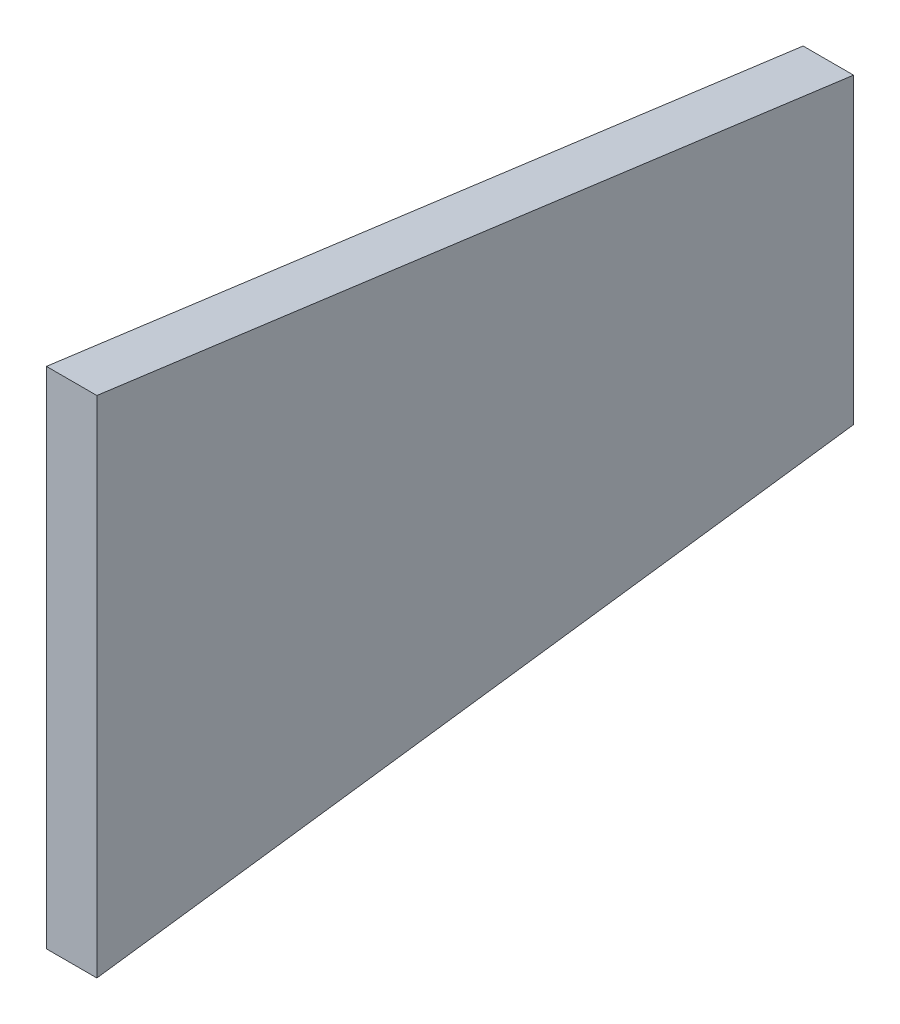
ISO-10303-21;
HEADER;
FILE_DESCRIPTION(('STEP AP214'),'2;1');
FILE_NAME('part.step','',(''),(''),'','','');
FILE_SCHEMA(('AUTOMOTIVE_DESIGN { 1 0 10303 214 1 1 1 1 }'));
ENDSEC;
DATA;
#1=APPLICATION_CONTEXT('core data for automotive mechanical design processes');
#2=APPLICATION_PROTOCOL_DEFINITION('international standard','automotive_design',2000,#1);
#3=PRODUCT_CONTEXT('',#1,'mechanical');
#4=PRODUCT('Part','Part','',(#3));
#5=PRODUCT_RELATED_PRODUCT_CATEGORY('part','',(#4));
#6=PRODUCT_DEFINITION_FORMATION('','',#4);
#7=PRODUCT_DEFINITION_CONTEXT('part definition',#1,'design');
#8=PRODUCT_DEFINITION('design','',#6,#7);
#9=PRODUCT_DEFINITION_SHAPE('','',#8);
#10=(LENGTH_UNIT() NAMED_UNIT(*) SI_UNIT(.MILLI.,.METRE.));
#11=(NAMED_UNIT(*) PLANE_ANGLE_UNIT() SI_UNIT($,.RADIAN.));
#12=(NAMED_UNIT(*) SI_UNIT($,.STERADIAN.) SOLID_ANGLE_UNIT());
#13=UNCERTAINTY_MEASURE_WITH_UNIT(LENGTH_MEASURE(1.E-05),#10,'distance_accuracy_value','');
#14=(GEOMETRIC_REPRESENTATION_CONTEXT(3) GLOBAL_UNCERTAINTY_ASSIGNED_CONTEXT((#13)) GLOBAL_UNIT_ASSIGNED_CONTEXT((#10,
#11,#12)) REPRESENTATION_CONTEXT('',''));
#15=CARTESIAN_POINT('',(0.,0.,0.));
#16=DIRECTION('',(0.,0.,1.));
#17=DIRECTION('',(1.,0.,0.));
#18=AXIS2_PLACEMENT_3D('',#15,#16,#17);
#19=CARTESIAN_POINT('',(10.,-100.,0.));
#20=DIRECTION('',(0.,0.,-1.));
#21=DIRECTION('',(-1.,0.,0.));
#22=AXIS2_PLACEMENT_3D('',#19,#20,#21);
#23=PLANE('',#22);
#24=DIRECTION('',(0.,-1.,0.));
#25=VECTOR('',#24,1.);
#26=CARTESIAN_POINT('',(0.,-100.,0.));
#27=LINE('',#26,#25);
#28=CARTESIAN_POINT('',(0.,0.,0.));
#29=VERTEX_POINT('',#28);
#30=CARTESIAN_POINT('',(0.,-100.,0.));
#31=VERTEX_POINT('',#30);
#32=EDGE_CURVE('E102',#29,#31,#27,.T.);
#33=ORIENTED_EDGE('',*,*,#32,.T.);
#34=DIRECTION('',(-1.,0.,0.));
#35=VECTOR('',#34,1.);
#36=CARTESIAN_POINT('',(10.,-100.,0.));
#37=LINE('',#36,#35);
#38=CARTESIAN_POINT('',(10.,-100.,0.));
#39=VERTEX_POINT('',#38);
#40=EDGE_CURVE('E11',#39,#31,#37,.T.);
#41=ORIENTED_EDGE('',*,*,#40,.F.);
#42=DIRECTION('',(0.,-1.,0.));
#43=VECTOR('',#42,1.);
#44=CARTESIAN_POINT('',(10.,-100.,0.));
#45=LINE('',#44,#43);
#46=CARTESIAN_POINT('',(10.,0.,0.));
#47=VERTEX_POINT('',#46);
#48=EDGE_CURVE('E90',#47,#39,#45,.T.);
#49=ORIENTED_EDGE('',*,*,#48,.F.);
#50=DIRECTION('',(-1.,0.,0.));
#51=VECTOR('',#50,1.);
#52=CARTESIAN_POINT('',(10.,0.,0.));
#53=LINE('',#52,#51);
#54=EDGE_CURVE('E98',#47,#29,#53,.T.);
#55=ORIENTED_EDGE('',*,*,#54,.T.);
#56=EDGE_LOOP('',(#33,#41,#49,#55));
#57=FACE_BOUND('',#56,.T.);
#58=ADVANCED_FACE('F39',(#57),#23,.F.);
#59=CARTESIAN_POINT('',(10.,-80.,-150.));
#60=DIRECTION('',(0.,0.991227900682635,0.132163720091018));
#61=DIRECTION('',(0.,-0.132163720091018,0.991227900682635));
#62=AXIS2_PLACEMENT_3D('',#59,#60,#61);
#63=PLANE('',#62);
#64=DIRECTION('',(0.,0.132163720091018,-0.991227900682635));
#65=VECTOR('',#64,1.);
#66=CARTESIAN_POINT('',(0.,-80.,-150.));
#67=LINE('',#66,#65);
#68=CARTESIAN_POINT('',(0.,-80.,-150.));
#69=VERTEX_POINT('',#68);
#70=EDGE_CURVE('E94',#31,#69,#67,.T.);
#71=ORIENTED_EDGE('',*,*,#70,.T.);
#72=DIRECTION('',(-1.,0.,0.));
#73=VECTOR('',#72,1.);
#74=CARTESIAN_POINT('',(10.,-80.,-150.));
#75=LINE('',#74,#73);
#76=CARTESIAN_POINT('',(10.,-80.,-150.));
#77=VERTEX_POINT('',#76);
#78=EDGE_CURVE('E47',#77,#69,#75,.T.);
#79=ORIENTED_EDGE('',*,*,#78,.F.);
#80=DIRECTION('',(0.,0.132163720091018,-0.991227900682635));
#81=VECTOR('',#80,1.);
#82=CARTESIAN_POINT('',(10.,-80.,-150.));
#83=LINE('',#82,#81);
#84=EDGE_CURVE('E85',#39,#77,#83,.T.);
#85=ORIENTED_EDGE('',*,*,#84,.F.);
#86=ORIENTED_EDGE('',*,*,#40,.T.);
#87=EDGE_LOOP('',(#71,#79,#85,#86));
#88=FACE_BOUND('',#87,.T.);
#89=ADVANCED_FACE('F93',(#88),#63,.F.);
#90=CARTESIAN_POINT('',(10.,-20.,-150.));
#91=DIRECTION('',(0.,0.,1.));
#92=DIRECTION('',(1.,0.,0.));
#93=AXIS2_PLACEMENT_3D('',#90,#91,#92);
#94=PLANE('',#93);
#95=DIRECTION('',(0.,1.,0.));
#96=VECTOR('',#95,1.);
#97=CARTESIAN_POINT('',(0.,-20.,-150.));
#98=LINE('',#97,#96);
#99=CARTESIAN_POINT('',(0.,-20.,-150.));
#100=VERTEX_POINT('',#99);
#101=EDGE_CURVE('E72',#69,#100,#98,.T.);
#102=ORIENTED_EDGE('',*,*,#101,.T.);
#103=DIRECTION('',(-1.,0.,0.));
#104=VECTOR('',#103,1.);
#105=CARTESIAN_POINT('',(10.,-20.,-150.));
#106=LINE('',#105,#104);
#107=CARTESIAN_POINT('',(10.,-20.,-150.));
#108=VERTEX_POINT('',#107);
#109=EDGE_CURVE('E95',#108,#100,#106,.T.);
#110=ORIENTED_EDGE('',*,*,#109,.F.);
#111=DIRECTION('',(0.,1.,0.));
#112=VECTOR('',#111,1.);
#113=CARTESIAN_POINT('',(10.,-20.,-150.));
#114=LINE('',#113,#112);
#115=EDGE_CURVE('E88',#77,#108,#114,.T.);
#116=ORIENTED_EDGE('',*,*,#115,.F.);
#117=ORIENTED_EDGE('',*,*,#78,.T.);
#118=EDGE_LOOP('',(#102,#110,#116,#117));
#119=FACE_BOUND('',#118,.T.);
#120=ADVANCED_FACE('F96',(#119),#94,.F.);
#121=CARTESIAN_POINT('',(10.,0.,0.));
#122=DIRECTION('',(0.,-0.991227900682635,0.132163720091018));
#123=DIRECTION('',(0.,-0.132163720091018,-0.991227900682635));
#124=AXIS2_PLACEMENT_3D('',#121,#122,#123);
#125=PLANE('',#124);
#126=DIRECTION('',(0.,0.132163720091018,0.991227900682635));
#127=VECTOR('',#126,1.);
#128=CARTESIAN_POINT('',(0.,0.,0.));
#129=LINE('',#128,#127);
#130=EDGE_CURVE('E78',#100,#29,#129,.T.);
#131=ORIENTED_EDGE('',*,*,#130,.T.);
#132=ORIENTED_EDGE('',*,*,#54,.F.);
#133=DIRECTION('',(0.,0.132163720091018,0.991227900682635));
#134=VECTOR('',#133,1.);
#135=CARTESIAN_POINT('',(10.,0.,0.));
#136=LINE('',#135,#134);
#137=EDGE_CURVE('E55',#108,#47,#136,.T.);
#138=ORIENTED_EDGE('',*,*,#137,.F.);
#139=ORIENTED_EDGE('',*,*,#109,.T.);
#140=EDGE_LOOP('',(#131,#132,#138,#139));
#141=FACE_BOUND('',#140,.T.);
#142=ADVANCED_FACE('F109',(#141),#125,.F.);
#143=CARTESIAN_POINT('',(10.,0.,0.));
#144=DIRECTION('',(-1.,0.,0.));
#145=DIRECTION('',(0.,0.,1.));
#146=AXIS2_PLACEMENT_3D('',#143,#144,#145);
#147=PLANE('',#146);
#148=ORIENTED_EDGE('',*,*,#48,.T.);
#149=ORIENTED_EDGE('',*,*,#84,.T.);
#150=ORIENTED_EDGE('',*,*,#115,.T.);
#151=ORIENTED_EDGE('',*,*,#137,.T.);
#152=EDGE_LOOP('',(#148,#149,#150,#151));
#153=FACE_BOUND('',#152,.T.);
#154=ADVANCED_FACE('F86',(#153),#147,.F.);
#155=CARTESIAN_POINT('',(0.,0.,0.));
#156=DIRECTION('',(-1.,0.,0.));
#157=DIRECTION('',(0.,0.,1.));
#158=AXIS2_PLACEMENT_3D('',#155,#156,#157);
#159=PLANE('',#158);
#160=ORIENTED_EDGE('',*,*,#32,.F.);
#161=ORIENTED_EDGE('',*,*,#130,.F.);
#162=ORIENTED_EDGE('',*,*,#101,.F.);
#163=ORIENTED_EDGE('',*,*,#70,.F.);
#164=EDGE_LOOP('',(#160,#161,#162,#163));
#165=FACE_BOUND('',#164,.T.);
#166=ADVANCED_FACE('F112',(#165),#159,.T.);
#167=CLOSED_SHELL('',(#58,#89,#120,#142,#154,#166));
#168=MANIFOLD_SOLID_BREP('B2',#167);
#169=ADVANCED_BREP_SHAPE_REPRESENTATION('',(#18,#168),#14);
#170=SHAPE_DEFINITION_REPRESENTATION(#9,#169);
ENDSEC;
END-ISO-10303-21;
